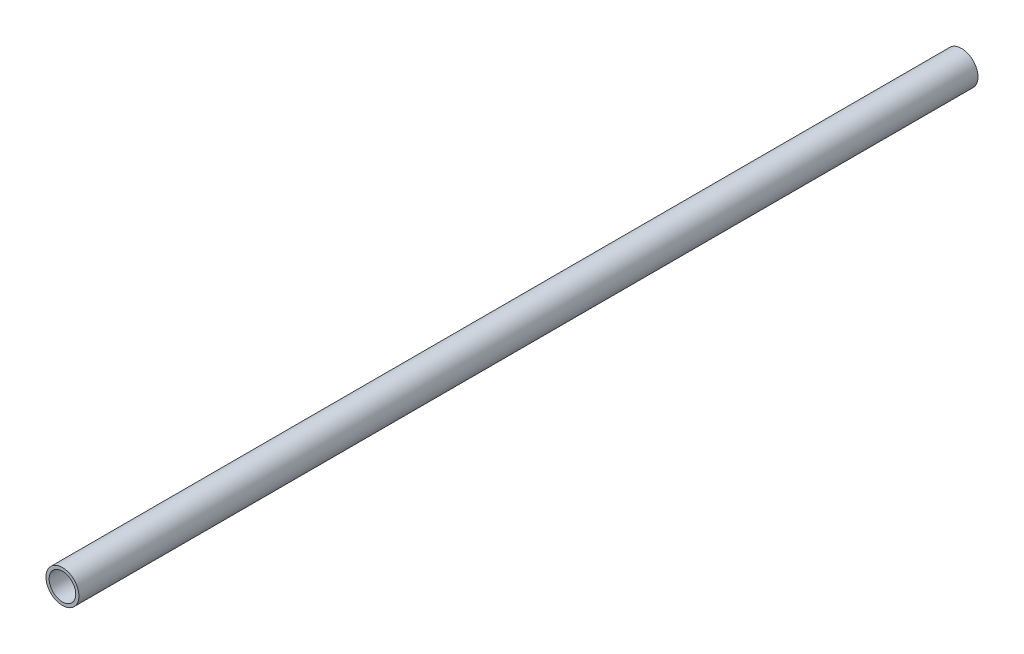
ISO-10303-21;
HEADER;
FILE_DESCRIPTION(('STEP AP214'),'2;1');
FILE_NAME('part.step','',(''),(''),'','','');
FILE_SCHEMA(('AUTOMOTIVE_DESIGN { 1 0 10303 214 1 1 1 1 }'));
ENDSEC;
DATA;
#1=APPLICATION_CONTEXT('core data for automotive mechanical design processes');
#2=APPLICATION_PROTOCOL_DEFINITION('international standard','automotive_design',2000,#1);
#3=PRODUCT_CONTEXT('',#1,'mechanical');
#4=PRODUCT('Part','Part','',(#3));
#5=PRODUCT_RELATED_PRODUCT_CATEGORY('part','',(#4));
#6=PRODUCT_DEFINITION_FORMATION('','',#4);
#7=PRODUCT_DEFINITION_CONTEXT('part definition',#1,'design');
#8=PRODUCT_DEFINITION('design','',#6,#7);
#9=PRODUCT_DEFINITION_SHAPE('','',#8);
#10=(LENGTH_UNIT() NAMED_UNIT(*) SI_UNIT(.MILLI.,.METRE.));
#11=(NAMED_UNIT(*) PLANE_ANGLE_UNIT() SI_UNIT($,.RADIAN.));
#12=(NAMED_UNIT(*) SI_UNIT($,.STERADIAN.) SOLID_ANGLE_UNIT());
#13=UNCERTAINTY_MEASURE_WITH_UNIT(LENGTH_MEASURE(1.E-05),#10,'distance_accuracy_value','');
#14=(GEOMETRIC_REPRESENTATION_CONTEXT(3) GLOBAL_UNCERTAINTY_ASSIGNED_CONTEXT((#13)) GLOBAL_UNIT_ASSIGNED_CONTEXT((#10,
#11,#12)) REPRESENTATION_CONTEXT('',''));
#15=CARTESIAN_POINT('',(0.,0.,0.));
#16=DIRECTION('',(0.,0.,1.));
#17=DIRECTION('',(1.,0.,0.));
#18=AXIS2_PLACEMENT_3D('',#15,#16,#17);
#19=CARTESIAN_POINT('',(0.,0.,273.));
#20=DIRECTION('',(0.,0.,1.));
#21=DIRECTION('',(1.,0.,0.));
#22=AXIS2_PLACEMENT_3D('',#19,#20,#21);
#23=PLANE('',#22);
#24=CARTESIAN_POINT('',(0.,0.,273.));
#25=DIRECTION('',(0.,0.,1.));
#26=DIRECTION('',(1.,0.,0.));
#27=AXIS2_PLACEMENT_3D('',#24,#25,#26);
#28=CIRCLE('',#27,5.);
#29=CARTESIAN_POINT('',(5.,0.,273.));
#30=VERTEX_POINT('',#29);
#31=EDGE_CURVE('E10',#30,#30,#28,.T.);
#32=ORIENTED_EDGE('',*,*,#31,.T.);
#33=EDGE_LOOP('',(#32));
#34=FACE_BOUND('',#33,.T.);
#35=CARTESIAN_POINT('',(0.,0.,273.));
#36=DIRECTION('',(0.,0.,1.));
#37=DIRECTION('',(1.,0.,0.));
#38=AXIS2_PLACEMENT_3D('',#35,#36,#37);
#39=CIRCLE('',#38,4.05);
#40=CARTESIAN_POINT('',(4.05,0.,273.));
#41=VERTEX_POINT('',#40);
#42=EDGE_CURVE('E54',#41,#41,#39,.T.);
#43=ORIENTED_EDGE('',*,*,#42,.F.);
#44=EDGE_LOOP('',(#43));
#45=FACE_BOUND('',#44,.T.);
#46=ADVANCED_FACE('F41',(#34,#45),#23,.T.);
#47=CARTESIAN_POINT('',(0.,0.,0.));
#48=DIRECTION('',(0.,0.,1.));
#49=DIRECTION('',(1.,0.,0.));
#50=AXIS2_PLACEMENT_3D('',#47,#48,#49);
#51=PLANE('',#50);
#52=CARTESIAN_POINT('',(0.,0.,0.));
#53=DIRECTION('',(0.,0.,1.));
#54=DIRECTION('',(1.,0.,0.));
#55=AXIS2_PLACEMENT_3D('',#52,#53,#54);
#56=CIRCLE('',#55,5.);
#57=CARTESIAN_POINT('',(5.,0.,0.));
#58=VERTEX_POINT('',#57);
#59=EDGE_CURVE('E45',#58,#58,#56,.T.);
#60=ORIENTED_EDGE('',*,*,#59,.F.);
#61=EDGE_LOOP('',(#60));
#62=FACE_BOUND('',#61,.T.);
#63=CARTESIAN_POINT('',(0.,0.,0.));
#64=DIRECTION('',(0.,0.,1.));
#65=DIRECTION('',(1.,0.,0.));
#66=AXIS2_PLACEMENT_3D('',#63,#64,#65);
#67=CIRCLE('',#66,4.05);
#68=CARTESIAN_POINT('',(4.05,0.,0.));
#69=VERTEX_POINT('',#68);
#70=EDGE_CURVE('E56',#69,#69,#67,.T.);
#71=ORIENTED_EDGE('',*,*,#70,.T.);
#72=EDGE_LOOP('',(#71));
#73=FACE_BOUND('',#72,.T.);
#74=ADVANCED_FACE('F68',(#62,#73),#51,.F.);
#75=CARTESIAN_POINT('',(0.,0.,273.));
#76=DIRECTION('',(0.,0.,-1.));
#77=DIRECTION('',(-1.,0.,0.));
#78=AXIS2_PLACEMENT_3D('',#75,#76,#77);
#79=CYLINDRICAL_SURFACE('',#78,5.);
#80=ORIENTED_EDGE('',*,*,#31,.F.);
#81=EDGE_LOOP('',(#80));
#82=FACE_BOUND('',#81,.T.);
#83=ORIENTED_EDGE('',*,*,#59,.T.);
#84=EDGE_LOOP('',(#83));
#85=FACE_BOUND('',#84,.T.);
#86=ADVANCED_FACE('F43',(#82,#85),#79,.T.);
#87=CARTESIAN_POINT('',(0.,0.,273.));
#88=DIRECTION('',(0.,0.,-1.));
#89=DIRECTION('',(-1.,0.,0.));
#90=AXIS2_PLACEMENT_3D('',#87,#88,#89);
#91=CYLINDRICAL_SURFACE('',#90,4.05);
#92=ORIENTED_EDGE('',*,*,#42,.T.);
#93=EDGE_LOOP('',(#92));
#94=FACE_BOUND('',#93,.T.);
#95=ORIENTED_EDGE('',*,*,#70,.F.);
#96=EDGE_LOOP('',(#95));
#97=FACE_BOUND('',#96,.T.);
#98=ADVANCED_FACE('F64',(#94,#97),#91,.F.);
#99=CLOSED_SHELL('',(#46,#74,#86,#98));
#100=MANIFOLD_SOLID_BREP('B2',#99);
#101=ADVANCED_BREP_SHAPE_REPRESENTATION('',(#18,#100),#14);
#102=SHAPE_DEFINITION_REPRESENTATION(#9,#101);
ENDSEC;
END-ISO-10303-21;
